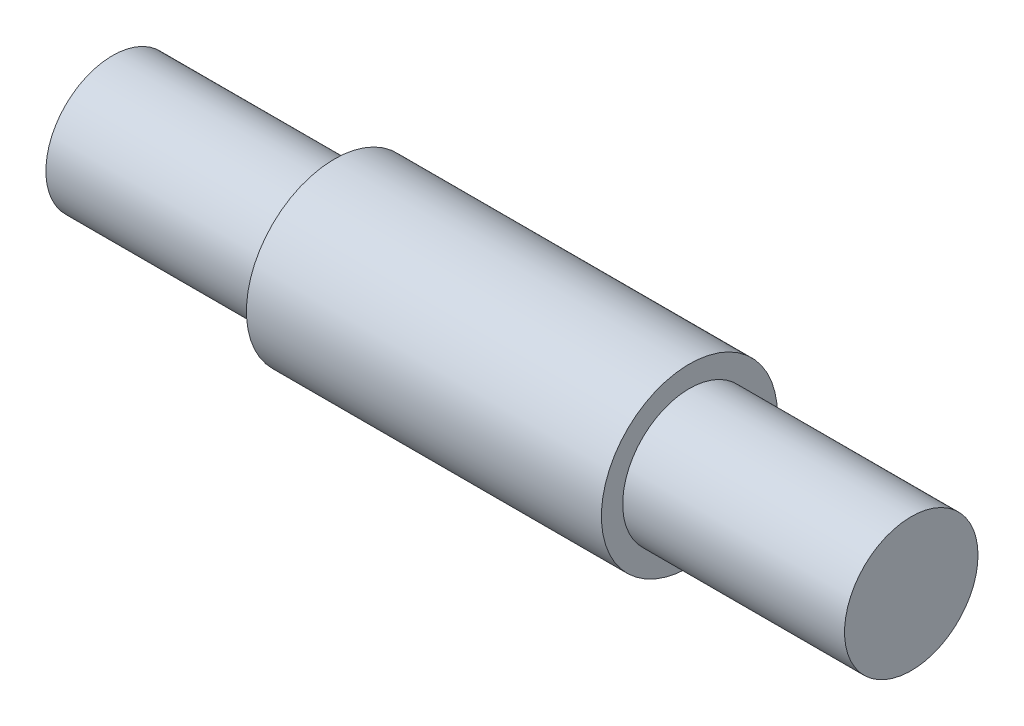
ISO-10303-21;
HEADER;
FILE_DESCRIPTION(('STEP AP214'),'2;1');
FILE_NAME('part.step','',(''),(''),'','','');
FILE_SCHEMA(('AUTOMOTIVE_DESIGN { 1 0 10303 214 1 1 1 1 }'));
ENDSEC;
DATA;
#1=APPLICATION_CONTEXT('core data for automotive mechanical design processes');
#2=APPLICATION_PROTOCOL_DEFINITION('international standard','automotive_design',2000,#1);
#3=PRODUCT_CONTEXT('',#1,'mechanical');
#4=PRODUCT('Part','Part','',(#3));
#5=PRODUCT_RELATED_PRODUCT_CATEGORY('part','',(#4));
#6=PRODUCT_DEFINITION_FORMATION('','',#4);
#7=PRODUCT_DEFINITION_CONTEXT('part definition',#1,'design');
#8=PRODUCT_DEFINITION('design','',#6,#7);
#9=PRODUCT_DEFINITION_SHAPE('','',#8);
#10=(LENGTH_UNIT() NAMED_UNIT(*) SI_UNIT(.MILLI.,.METRE.));
#11=(NAMED_UNIT(*) PLANE_ANGLE_UNIT() SI_UNIT($,.RADIAN.));
#12=(NAMED_UNIT(*) SI_UNIT($,.STERADIAN.) SOLID_ANGLE_UNIT());
#13=UNCERTAINTY_MEASURE_WITH_UNIT(LENGTH_MEASURE(1.E-05),#10,'distance_accuracy_value','');
#14=(GEOMETRIC_REPRESENTATION_CONTEXT(3) GLOBAL_UNCERTAINTY_ASSIGNED_CONTEXT((#13)) GLOBAL_UNIT_ASSIGNED_CONTEXT((#10,
#11,#12)) REPRESENTATION_CONTEXT('',''));
#15=CARTESIAN_POINT('',(0.,0.,0.));
#16=DIRECTION('',(0.,0.,1.));
#17=DIRECTION('',(1.,0.,0.));
#18=AXIS2_PLACEMENT_3D('',#15,#16,#17);
#19=CARTESIAN_POINT('',(14.2875,0.,0.));
#20=DIRECTION('',(-1.,0.,0.));
#21=DIRECTION('',(0.,0.,1.));
#22=AXIS2_PLACEMENT_3D('',#19,#20,#21);
#23=CYLINDRICAL_SURFACE('',#22,3.1496);
#24=CARTESIAN_POINT('',(6.35,0.,0.));
#25=DIRECTION('',(1.,0.,0.));
#26=DIRECTION('',(0.,0.,-1.));
#27=AXIS2_PLACEMENT_3D('',#24,#25,#26);
#28=CIRCLE('',#27,3.1496);
#29=CARTESIAN_POINT('',(6.35,0.,-3.1496));
#30=VERTEX_POINT('',#29);
#31=EDGE_CURVE('E10',#30,#30,#28,.T.);
#32=ORIENTED_EDGE('',*,*,#31,.F.);
#33=EDGE_LOOP('',(#32));
#34=FACE_BOUND('',#33,.T.);
#35=CARTESIAN_POINT('',(-6.35,0.,0.));
#36=DIRECTION('',(1.,0.,0.));
#37=DIRECTION('',(0.,0.,-1.));
#38=AXIS2_PLACEMENT_3D('',#35,#36,#37);
#39=CIRCLE('',#38,3.1496);
#40=CARTESIAN_POINT('',(-6.35,0.,-3.1496));
#41=VERTEX_POINT('',#40);
#42=EDGE_CURVE('E55',#41,#41,#39,.T.);
#43=ORIENTED_EDGE('',*,*,#42,.T.);
#44=EDGE_LOOP('',(#43));
#45=FACE_BOUND('',#44,.T.);
#46=ADVANCED_FACE('F37',(#34,#45),#23,.T.);
#47=CARTESIAN_POINT('',(6.35,0.,0.));
#48=DIRECTION('',(1.,0.,0.));
#49=DIRECTION('',(0.,0.,-1.));
#50=AXIS2_PLACEMENT_3D('',#47,#48,#49);
#51=PLANE('',#50);
#52=CARTESIAN_POINT('',(6.35,0.,0.));
#53=DIRECTION('',(1.,0.,0.));
#54=DIRECTION('',(0.,0.,-1.));
#55=AXIS2_PLACEMENT_3D('',#52,#53,#54);
#56=CIRCLE('',#55,2.3876);
#57=CARTESIAN_POINT('',(6.35,0.,-2.3876));
#58=VERTEX_POINT('',#57);
#59=EDGE_CURVE('E44',#58,#58,#56,.T.);
#60=ORIENTED_EDGE('',*,*,#59,.F.);
#61=EDGE_LOOP('',(#60));
#62=FACE_BOUND('',#61,.T.);
#63=ORIENTED_EDGE('',*,*,#31,.T.);
#64=EDGE_LOOP('',(#63));
#65=FACE_BOUND('',#64,.T.);
#66=ADVANCED_FACE('F83',(#62,#65),#51,.T.);
#67=CARTESIAN_POINT('',(6.35,0.,0.));
#68=DIRECTION('',(1.,0.,0.));
#69=DIRECTION('',(0.,0.,-1.));
#70=AXIS2_PLACEMENT_3D('',#67,#68,#69);
#71=CYLINDRICAL_SURFACE('',#70,2.3876);
#72=ORIENTED_EDGE('',*,*,#59,.T.);
#73=EDGE_LOOP('',(#72));
#74=FACE_BOUND('',#73,.T.);
#75=CARTESIAN_POINT('',(14.2875,0.,0.));
#76=DIRECTION('',(1.,0.,0.));
#77=DIRECTION('',(0.,0.,-1.));
#78=AXIS2_PLACEMENT_3D('',#75,#76,#77);
#79=CIRCLE('',#78,2.3876);
#80=CARTESIAN_POINT('',(14.2875,0.,-2.3876));
#81=VERTEX_POINT('',#80);
#82=EDGE_CURVE('E49',#81,#81,#79,.T.);
#83=ORIENTED_EDGE('',*,*,#82,.F.);
#84=EDGE_LOOP('',(#83));
#85=FACE_BOUND('',#84,.T.);
#86=ADVANCED_FACE('F88',(#74,#85),#71,.T.);
#87=CARTESIAN_POINT('',(14.2875,0.,0.));
#88=DIRECTION('',(1.,0.,0.));
#89=DIRECTION('',(0.,0.,-1.));
#90=AXIS2_PLACEMENT_3D('',#87,#88,#89);
#91=PLANE('',#90);
#92=ORIENTED_EDGE('',*,*,#82,.T.);
#93=EDGE_LOOP('',(#92));
#94=FACE_BOUND('',#93,.T.);
#95=ADVANCED_FACE('F95',(#94),#91,.T.);
#96=CARTESIAN_POINT('',(-6.35,0.,0.));
#97=DIRECTION('',(-1.,0.,0.));
#98=DIRECTION('',(0.,0.,-1.));
#99=AXIS2_PLACEMENT_3D('',#96,#97,#98);
#100=PLANE('',#99);
#101=ORIENTED_EDGE('',*,*,#42,.F.);
#102=EDGE_LOOP('',(#101));
#103=FACE_BOUND('',#102,.T.);
#104=CARTESIAN_POINT('',(-6.35,0.,0.));
#105=DIRECTION('',(1.,0.,0.));
#106=DIRECTION('',(0.,0.,-1.));
#107=AXIS2_PLACEMENT_3D('',#104,#105,#106);
#108=CIRCLE('',#107,2.3876);
#109=CARTESIAN_POINT('',(-6.35,0.,-2.3876));
#110=VERTEX_POINT('',#109);
#111=EDGE_CURVE('E60',#110,#110,#108,.T.);
#112=ORIENTED_EDGE('',*,*,#111,.T.);
#113=EDGE_LOOP('',(#112));
#114=FACE_BOUND('',#113,.T.);
#115=ADVANCED_FACE('F69',(#103,#114),#100,.T.);
#116=CARTESIAN_POINT('',(-6.35,0.,0.));
#117=DIRECTION('',(-1.,0.,0.));
#118=DIRECTION('',(0.,0.,1.));
#119=AXIS2_PLACEMENT_3D('',#116,#117,#118);
#120=CYLINDRICAL_SURFACE('',#119,2.3876);
#121=ORIENTED_EDGE('',*,*,#111,.F.);
#122=EDGE_LOOP('',(#121));
#123=FACE_BOUND('',#122,.T.);
#124=CARTESIAN_POINT('',(-14.2875,0.,0.));
#125=DIRECTION('',(1.,0.,0.));
#126=DIRECTION('',(0.,0.,-1.));
#127=AXIS2_PLACEMENT_3D('',#124,#125,#126);
#128=CIRCLE('',#127,2.3876);
#129=CARTESIAN_POINT('',(-14.2875,0.,-2.3876));
#130=VERTEX_POINT('',#129);
#131=EDGE_CURVE('E61',#130,#130,#128,.T.);
#132=ORIENTED_EDGE('',*,*,#131,.T.);
#133=EDGE_LOOP('',(#132));
#134=FACE_BOUND('',#133,.T.);
#135=ADVANCED_FACE('F71',(#123,#134),#120,.T.);
#136=CARTESIAN_POINT('',(-14.2875,0.,0.));
#137=DIRECTION('',(1.,0.,0.));
#138=DIRECTION('',(0.,0.,-1.));
#139=AXIS2_PLACEMENT_3D('',#136,#137,#138);
#140=PLANE('',#139);
#141=ORIENTED_EDGE('',*,*,#131,.F.);
#142=EDGE_LOOP('',(#141));
#143=FACE_BOUND('',#142,.T.);
#144=ADVANCED_FACE('F74',(#143),#140,.F.);
#145=CLOSED_SHELL('',(#46,#66,#86,#95,#115,#135,#144));
#146=MANIFOLD_SOLID_BREP('B2',#145);
#147=ADVANCED_BREP_SHAPE_REPRESENTATION('',(#18,#146),#14);
#148=SHAPE_DEFINITION_REPRESENTATION(#9,#147);
ENDSEC;
END-ISO-10303-21;
